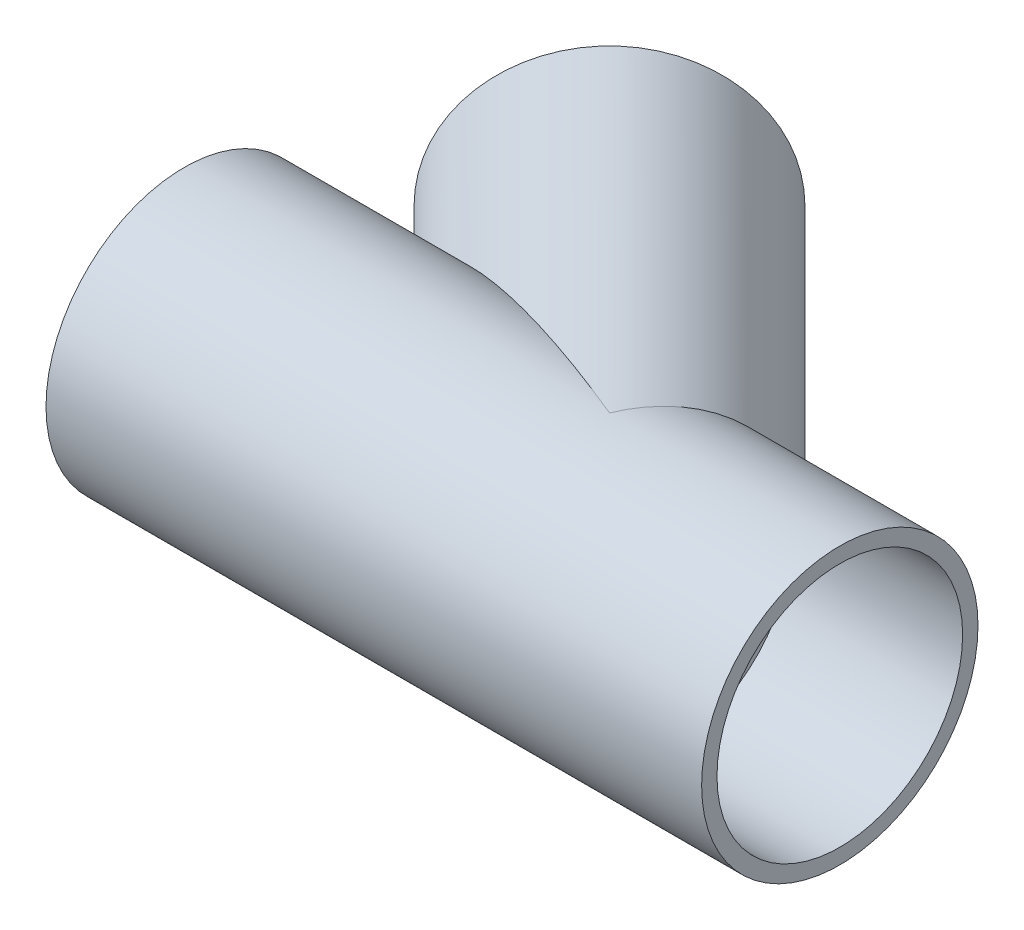
ISO-10303-21;
HEADER;
FILE_DESCRIPTION(('STEP AP214'),'2;1');
FILE_NAME('part.step','',(''),(''),'','','');
FILE_SCHEMA(('AUTOMOTIVE_DESIGN { 1 0 10303 214 1 1 1 1 }'));
ENDSEC;
DATA;
#1=APPLICATION_CONTEXT('core data for automotive mechanical design processes');
#2=APPLICATION_PROTOCOL_DEFINITION('international standard','automotive_design',2000,#1);
#3=PRODUCT_CONTEXT('',#1,'mechanical');
#4=PRODUCT('Part','Part','',(#3));
#5=PRODUCT_RELATED_PRODUCT_CATEGORY('part','',(#4));
#6=PRODUCT_DEFINITION_FORMATION('','',#4);
#7=PRODUCT_DEFINITION_CONTEXT('part definition',#1,'design');
#8=PRODUCT_DEFINITION('design','',#6,#7);
#9=PRODUCT_DEFINITION_SHAPE('','',#8);
#10=(LENGTH_UNIT() NAMED_UNIT(*) SI_UNIT(.MILLI.,.METRE.));
#11=(NAMED_UNIT(*) PLANE_ANGLE_UNIT() SI_UNIT($,.RADIAN.));
#12=(NAMED_UNIT(*) SI_UNIT($,.STERADIAN.) SOLID_ANGLE_UNIT());
#13=UNCERTAINTY_MEASURE_WITH_UNIT(LENGTH_MEASURE(1.E-05),#10,'distance_accuracy_value','');
#14=(GEOMETRIC_REPRESENTATION_CONTEXT(3) GLOBAL_UNCERTAINTY_ASSIGNED_CONTEXT((#13)) GLOBAL_UNIT_ASSIGNED_CONTEXT((#10,
#11,#12)) REPRESENTATION_CONTEXT('',''));
#15=CARTESIAN_POINT('',(0.,0.,0.));
#16=DIRECTION('',(0.,0.,1.));
#17=DIRECTION('',(1.,0.,0.));
#18=AXIS2_PLACEMENT_3D('',#15,#16,#17);
#19=CARTESIAN_POINT('',(-6.29663489310153,0.,0.));
#20=DIRECTION('',(1.,0.,0.));
#21=DIRECTION('',(0.,0.,-1.));
#22=AXIS2_PLACEMENT_3D('',#19,#20,#21);
#23=CYLINDRICAL_SURFACE('',#22,13.6);
#24=CARTESIAN_POINT('',(7.8,0.,0.));
#25=DIRECTION('',(1.,0.,0.));
#26=DIRECTION('',(0.,0.,-1.));
#27=AXIS2_PLACEMENT_3D('',#24,#25,#26);
#28=CIRCLE('',#27,13.6);
#29=CARTESIAN_POINT('',(7.8,0.,-13.6));
#30=VERTEX_POINT('',#29);
#31=EDGE_CURVE('E149',#30,#30,#28,.T.);
#32=ORIENTED_EDGE('',*,*,#31,.T.);
#33=EDGE_LOOP('',(#32));
#34=FACE_BOUND('',#33,.T.);
#35=CARTESIAN_POINT('',(0.,0.,0.));
#36=DIRECTION('',(0.923879532511286,0.,0.382683432365091));
#37=DIRECTION('',(-0.382683432365091,0.,0.923879532511287));
#38=AXIS2_PLACEMENT_3D('',#35,#36,#37);
#39=ELLIPSE('',#38,14.7205339239766,13.6);
#40=CARTESIAN_POINT('',(0.,-13.6,0.));
#41=VERTEX_POINT('',#40);
#42=CARTESIAN_POINT('',(0.,13.6,0.));
#43=VERTEX_POINT('',#42);
#44=EDGE_CURVE('E153',#41,#43,#39,.T.);
#45=ORIENTED_EDGE('',*,*,#44,.F.);
#46=CARTESIAN_POINT('',(0.,0.,0.));
#47=DIRECTION('',(-0.38268343236509,0.,0.923879532511286));
#48=DIRECTION('',(0.923879532511286,0.,0.382683432365091));
#49=AXIS2_PLACEMENT_3D('',#46,#47,#48);
#50=ELLIPSE('',#49,35.5385126446374,13.6);
#51=EDGE_CURVE('E62',#41,#43,#50,.F.);
#52=ORIENTED_EDGE('',*,*,#51,.T.);
#53=EDGE_LOOP('',(#45,#52));
#54=FACE_BOUND('',#53,.T.);
#55=CARTESIAN_POINT('',(-33.2,0.,0.));
#56=DIRECTION('',(-1.,0.,0.));
#57=DIRECTION('',(0.,0.,1.));
#58=AXIS2_PLACEMENT_3D('',#55,#56,#57);
#59=CIRCLE('',#58,13.6);
#60=CARTESIAN_POINT('',(-33.2,0.,13.6));
#61=VERTEX_POINT('',#60);
#62=EDGE_CURVE('E57',#61,#61,#59,.T.);
#63=ORIENTED_EDGE('',*,*,#62,.T.);
#64=EDGE_LOOP('',(#63));
#65=FACE_BOUND('',#64,.T.);
#66=ADVANCED_FACE('F53',(#34,#54,#65),#23,.F.);
#67=CARTESIAN_POINT('',(-44.9355339059326,0.,-44.9355339059327));
#68=DIRECTION('',(0.707106781186546,0.,0.707106781186549));
#69=DIRECTION('',(0.707106781186549,0.,-0.707106781186546));
#70=AXIS2_PLACEMENT_3D('',#67,#68,#69);
#71=CYLINDRICAL_SURFACE('',#70,13.6);
#72=CARTESIAN_POINT('',(-33.2,-4.86853482768928,-15.2413046892835));
#73=CARTESIAN_POINT('',(-33.3244681017264,-4.72405159532943,-15.2874486021489));
#74=CARTESIAN_POINT('',(-33.4455982056215,-4.57622184765021,-15.3324136773489));
#75=CARTESIAN_POINT('',(-33.6800760102499,-4.27344722811289,-15.4195514218226));
#76=CARTESIAN_POINT('',(-33.7934144125979,-4.11849421113384,-15.4617207526722));
#77=CARTESIAN_POINT('',(-34.0124551916055,-3.7991278618265,-15.5432992517087));
#78=CARTESIAN_POINT('',(-34.1180256285823,-3.63461113339689,-15.5826604838994));
#79=CARTESIAN_POINT('',(-34.3181189273945,-3.29813985669914,-15.6573293322666));
#80=CARTESIAN_POINT('',(-34.4126450147334,-3.12618750020844,-15.6926381319028));
#81=CARTESIAN_POINT('',(-34.5896291935247,-2.77357849560614,-15.7587968584561));
#82=CARTESIAN_POINT('',(-34.6719874888855,-2.59286445351396,-15.7896098895119));
#83=CARTESIAN_POINT('',(-34.8218064059133,-2.2245451063047,-15.8456957854302));
#84=CARTESIAN_POINT('',(-34.8892713407612,-2.03694181474915,-15.8709702542685));
#85=CARTESIAN_POINT('',(-35.0070871739665,-1.65683743685648,-15.9151272754877));
#86=CARTESIAN_POINT('',(-35.0575326254052,-1.4643700171583,-15.934045140012));
#87=CARTESIAN_POINT('',(-35.1401571365977,-1.07500273336272,-15.9650392676209));
#88=CARTESIAN_POINT('',(-35.1723393757944,-0.878103646983305,-15.9771167215519));
#89=CARTESIAN_POINT('',(-35.2153998054927,-0.498160700046245,-15.993278378903));
#90=CARTESIAN_POINT('',(-35.2278180495339,-0.315315688887114,-15.9979403897848));
#91=CARTESIAN_POINT('',(-35.2358783704707,0.0507902895660343,-16.0009662526997));
#92=CARTESIAN_POINT('',(-35.2315217087008,0.234051224550463,-15.9993305782666));
#93=CARTESIAN_POINT('',(-35.206164302814,0.599468591416893,-15.9898120311146));
#94=CARTESIAN_POINT('',(-35.1851432454321,0.781623401736292,-15.9819215340052));
#95=CARTESIAN_POINT('',(-35.1271185243967,1.14300160026838,-15.9601481955119));
#96=CARTESIAN_POINT('',(-35.0901129690087,1.32222463890511,-15.9462646448619));
#97=CARTESIAN_POINT('',(-34.9980354776251,1.68909129558625,-15.9117349686436));
#98=CARTESIAN_POINT('',(-34.9418584111708,1.87641728637466,-15.8906753356013));
#99=CARTESIAN_POINT('',(-34.8141119481743,2.24493420975253,-15.8428158345539));
#100=CARTESIAN_POINT('',(-34.7425426745378,2.42612519131629,-15.8160160123838));
#101=CARTESIAN_POINT('',(-34.5856500647023,2.78204568442004,-15.7573106471418));
#102=CARTESIAN_POINT('',(-34.5002962410491,2.95675979283973,-15.725393787823));
#103=CARTESIAN_POINT('',(-34.3176792081304,3.29902710740497,-15.6571671380452));
#104=CARTESIAN_POINT('',(-34.2204100034332,3.46657665090183,-15.6208551362042));
#105=CARTESIAN_POINT('',(-33.9810302650555,3.84977407005102,-15.5315810921899));
#106=CARTESIAN_POINT('',(-33.8348752648837,4.06253927334722,-15.4771395682447));
#107=CARTESIAN_POINT('',(-33.5277565233446,4.47507223991705,-15.3629186420274));
#108=CARTESIAN_POINT('',(-33.3668170767776,4.67486043708517,-15.3031480015146));
#109=CARTESIAN_POINT('',(-33.2,4.86853482768928,-15.2413046892835));
#110=B_SPLINE_CURVE_WITH_KNOTS('',3,(#72,#73,#74,#75,#76,#77,#78,#79,#80,#81,#82,#83,#84,#85,
#86,#87,#88,#89,#90,#91,#92,#93,#94,#95,#96,#97,#98,#99,#100,#101,#102,#103,#104,#105,#106,#107,
#108,#109),.UNSPECIFIED.,.F.,.F.,(4,2,2,2,2,2,2,2,2,2,2,2,2,2,2,2,2,2,4),(0.,0.588662312954064,
1.17801534280278,1.77577270218087,2.37335504776723,2.97559477402446,3.57765985961078,
4.17632281999822,4.77488152714232,5.32400262416036,5.8730824326083,6.42283257954953,
6.97264780619446,7.56188532143159,8.15111813181881,8.74167246684499,9.33252517962953,
10.1230714069509,10.9123410325832),.UNSPECIFIED.);
#111=CARTESIAN_POINT('',(-33.2,-4.86853482768928,-15.2413046892835));
#112=VERTEX_POINT('',#111);
#113=CARTESIAN_POINT('',(-33.2,4.86853482768928,-15.2413046892835));
#114=VERTEX_POINT('',#113);
#115=EDGE_CURVE('E101',#112,#114,#110,.T.);
#116=ORIENTED_EDGE('',*,*,#115,.F.);
#117=CARTESIAN_POINT('',(-33.2,0.,-33.2000000000001));
#118=DIRECTION('',(-1.,0.,0.));
#119=DIRECTION('',(0.,0.,1.));
#120=AXIS2_PLACEMENT_3D('',#117,#118,#119);
#121=ELLIPSE('',#120,19.2333044482741,13.6);
#122=EDGE_CURVE('E92',#112,#114,#121,.T.);
#123=ORIENTED_EDGE('',*,*,#122,.T.);
#124=EDGE_LOOP('',(#116,#123));
#125=FACE_BOUND('',#124,.T.);
#126=ORIENTED_EDGE('',*,*,#51,.F.);
#127=ORIENTED_EDGE('',*,*,#44,.T.);
#128=EDGE_LOOP('',(#126,#127));
#129=FACE_BOUND('',#128,.T.);
#130=CARTESIAN_POINT('',(-25.7022294576585,0.,-25.7022294576586));
#131=DIRECTION('',(-0.707106781186546,0.,-0.707106781186549));
#132=DIRECTION('',(-0.707106781186549,0.,0.707106781186546));
#133=AXIS2_PLACEMENT_3D('',#130,#131,#132);
#134=CIRCLE('',#133,13.6);
#135=CARTESIAN_POINT('',(-35.3188816817956,0.,-16.0855772335216));
#136=VERTEX_POINT('',#135);
#137=EDGE_CURVE('E302',#136,#136,#134,.T.);
#138=ORIENTED_EDGE('',*,*,#137,.T.);
#139=EDGE_LOOP('',(#138));
#140=FACE_BOUND('',#139,.T.);
#141=ADVANCED_FACE('F104',(#125,#129,#140),#71,.F.);
#142=CARTESIAN_POINT('',(30.,0.,0.));
#143=DIRECTION('',(-1.,0.,0.));
#144=DIRECTION('',(0.,0.,1.));
#145=AXIS2_PLACEMENT_3D('',#142,#143,#144);
#146=PLANE('',#145);
#147=CARTESIAN_POINT('',(30.,0.,0.));
#148=DIRECTION('',(1.,0.,0.));
#149=DIRECTION('',(0.,0.,-1.));
#150=AXIS2_PLACEMENT_3D('',#147,#148,#149);
#151=CIRCLE('',#150,16.);
#152=CARTESIAN_POINT('',(30.,0.,-16.));
#153=VERTEX_POINT('',#152);
#154=EDGE_CURVE('E282',#153,#153,#151,.T.);
#155=ORIENTED_EDGE('',*,*,#154,.F.);
#156=EDGE_LOOP('',(#155));
#157=FACE_BOUND('',#156,.T.);
#158=CARTESIAN_POINT('',(30.,0.,0.));
#159=DIRECTION('',(-1.,0.,0.));
#160=DIRECTION('',(0.,0.,1.));
#161=AXIS2_PLACEMENT_3D('',#158,#159,#160);
#162=CIRCLE('',#161,18.);
#163=CARTESIAN_POINT('',(30.,0.,18.));
#164=VERTEX_POINT('',#163);
#165=EDGE_CURVE('E285',#164,#164,#162,.T.);
#166=ORIENTED_EDGE('',*,*,#165,.F.);
#167=EDGE_LOOP('',(#166));
#168=FACE_BOUND('',#167,.T.);
#169=ADVANCED_FACE('F55',(#157,#168),#146,.F.);
#170=CARTESIAN_POINT('',(-41.3999999999998,0.,-41.4));
#171=DIRECTION('',(-0.707106781186546,0.,-0.707106781186549));
#172=DIRECTION('',(-0.707106781186549,0.,0.707106781186546));
#173=AXIS2_PLACEMENT_3D('',#170,#171,#172);
#174=PLANE('',#173);
#175=CARTESIAN_POINT('',(-41.3999999999998,0.,-41.4));
#176=DIRECTION('',(-0.707106781186546,0.,-0.707106781186549));
#177=DIRECTION('',(-0.707106781186549,0.,0.707106781186546));
#178=AXIS2_PLACEMENT_3D('',#175,#176,#177);
#179=CIRCLE('',#178,16.);
#180=CARTESIAN_POINT('',(-52.7137084989846,0.,-30.0862915010152));
#181=VERTEX_POINT('',#180);
#182=EDGE_CURVE('E96',#181,#181,#179,.T.);
#183=ORIENTED_EDGE('',*,*,#182,.F.);
#184=EDGE_LOOP('',(#183));
#185=FACE_BOUND('',#184,.T.);
#186=CARTESIAN_POINT('',(-41.3999999999998,0.,-41.4));
#187=DIRECTION('',(-0.707106781186546,0.,-0.707106781186549));
#188=DIRECTION('',(-0.707106781186549,0.,0.707106781186546));
#189=AXIS2_PLACEMENT_3D('',#186,#187,#188);
#190=CIRCLE('',#189,18.);
#191=CARTESIAN_POINT('',(-54.1279220613577,0.,-28.6720779386422));
#192=VERTEX_POINT('',#191);
#193=EDGE_CURVE('E287',#192,#192,#190,.T.);
#194=ORIENTED_EDGE('',*,*,#193,.T.);
#195=EDGE_LOOP('',(#194));
#196=FACE_BOUND('',#195,.T.);
#197=ADVANCED_FACE('F202',(#185,#196),#174,.T.);
#198=CARTESIAN_POINT('',(-8.30142853498731,0.,0.));
#199=DIRECTION('',(1.,0.,0.));
#200=DIRECTION('',(0.,0.,-1.));
#201=AXIS2_PLACEMENT_3D('',#198,#199,#200);
#202=CYLINDRICAL_SURFACE('',#201,18.);
#203=CARTESIAN_POINT('',(0.,0.,0.));
#204=DIRECTION('',(0.923879532511287,0.,0.382683432365091));
#205=DIRECTION('',(-0.382683432365091,0.,0.923879532511287));
#206=AXIS2_PLACEMENT_3D('',#203,#204,#205);
#207=ELLIPSE('',#206,19.4830596052631,18.);
#208=CARTESIAN_POINT('',(0.,-18.,0.));
#209=VERTEX_POINT('',#208);
#210=CARTESIAN_POINT('',(0.,18.,0.));
#211=VERTEX_POINT('',#210);
#212=EDGE_CURVE('E291',#209,#211,#207,.T.);
#213=ORIENTED_EDGE('',*,*,#212,.T.);
#214=CARTESIAN_POINT('',(0.,0.,0.));
#215=DIRECTION('',(-0.382683432365091,0.,0.923879532511286));
#216=DIRECTION('',(0.923879532511286,0.,0.382683432365091));
#217=AXIS2_PLACEMENT_3D('',#214,#215,#216);
#218=ELLIPSE('',#217,47.0362667355494,18.);
#219=EDGE_CURVE('E297',#209,#211,#218,.F.);
#220=ORIENTED_EDGE('',*,*,#219,.F.);
#221=EDGE_LOOP('',(#213,#220));
#222=FACE_BOUND('',#221,.T.);
#223=ORIENTED_EDGE('',*,*,#165,.T.);
#224=EDGE_LOOP('',(#223));
#225=FACE_BOUND('',#224,.T.);
#226=CARTESIAN_POINT('',(-55.4,0.,0.));
#227=DIRECTION('',(1.,0.,0.));
#228=DIRECTION('',(0.,0.,-1.));
#229=AXIS2_PLACEMENT_3D('',#226,#227,#228);
#230=CIRCLE('',#229,18.);
#231=CARTESIAN_POINT('',(-55.4,0.,-18.));
#232=VERTEX_POINT('',#231);
#233=EDGE_CURVE('E288',#232,#232,#230,.T.);
#234=ORIENTED_EDGE('',*,*,#233,.T.);
#235=EDGE_LOOP('',(#234));
#236=FACE_BOUND('',#235,.T.);
#237=ADVANCED_FACE('F194',(#222,#225,#236),#202,.T.);
#238=CARTESIAN_POINT('',(-41.3999999999998,0.,-41.4));
#239=DIRECTION('',(0.707106781186546,0.,0.707106781186549));
#240=DIRECTION('',(0.707106781186549,0.,-0.707106781186546));
#241=AXIS2_PLACEMENT_3D('',#238,#239,#240);
#242=CYLINDRICAL_SURFACE('',#241,18.);
#243=ORIENTED_EDGE('',*,*,#193,.F.);
#244=EDGE_LOOP('',(#243));
#245=FACE_BOUND('',#244,.T.);
#246=ORIENTED_EDGE('',*,*,#212,.F.);
#247=ORIENTED_EDGE('',*,*,#219,.T.);
#248=EDGE_LOOP('',(#246,#247));
#249=FACE_BOUND('',#248,.T.);
#250=ADVANCED_FACE('F145',(#245,#249),#242,.T.);
#251=CARTESIAN_POINT('',(-55.4,0.,0.));
#252=DIRECTION('',(1.,0.,0.));
#253=DIRECTION('',(0.,0.,-1.));
#254=AXIS2_PLACEMENT_3D('',#251,#252,#253);
#255=PLANE('',#254);
#256=CARTESIAN_POINT('',(-55.4,0.,0.));
#257=DIRECTION('',(-1.,0.,0.));
#258=DIRECTION('',(0.,0.,1.));
#259=AXIS2_PLACEMENT_3D('',#256,#257,#258);
#260=CIRCLE('',#259,16.);
#261=CARTESIAN_POINT('',(-55.4,0.,16.));
#262=VERTEX_POINT('',#261);
#263=EDGE_CURVE('E102',#262,#262,#260,.T.);
#264=ORIENTED_EDGE('',*,*,#263,.F.);
#265=EDGE_LOOP('',(#264));
#266=FACE_BOUND('',#265,.T.);
#267=ORIENTED_EDGE('',*,*,#233,.F.);
#268=EDGE_LOOP('',(#267));
#269=FACE_BOUND('',#268,.T.);
#270=ADVANCED_FACE('F138',(#266,#269),#255,.F.);
#271=CARTESIAN_POINT('',(7.8,0.,0.));
#272=DIRECTION('',(1.,0.,0.));
#273=DIRECTION('',(0.,0.,-1.));
#274=AXIS2_PLACEMENT_3D('',#271,#272,#273);
#275=CYLINDRICAL_SURFACE('',#274,16.);
#276=CARTESIAN_POINT('',(7.8,0.,0.));
#277=DIRECTION('',(1.,0.,0.));
#278=DIRECTION('',(0.,0.,-1.));
#279=AXIS2_PLACEMENT_3D('',#276,#277,#278);
#280=CIRCLE('',#279,16.);
#281=CARTESIAN_POINT('',(7.8,0.,-16.));
#282=VERTEX_POINT('',#281);
#283=EDGE_CURVE('E301',#282,#282,#280,.T.);
#284=ORIENTED_EDGE('',*,*,#283,.F.);
#285=EDGE_LOOP('',(#284));
#286=FACE_BOUND('',#285,.T.);
#287=ORIENTED_EDGE('',*,*,#154,.T.);
#288=EDGE_LOOP('',(#287));
#289=FACE_BOUND('',#288,.T.);
#290=ADVANCED_FACE('F135',(#286,#289),#275,.F.);
#291=CARTESIAN_POINT('',(7.8,0.,0.));
#292=DIRECTION('',(1.,0.,0.));
#293=DIRECTION('',(0.,0.,-1.));
#294=AXIS2_PLACEMENT_3D('',#291,#292,#293);
#295=PLANE('',#294);
#296=ORIENTED_EDGE('',*,*,#31,.F.);
#297=EDGE_LOOP('',(#296));
#298=FACE_BOUND('',#297,.T.);
#299=ORIENTED_EDGE('',*,*,#283,.T.);
#300=EDGE_LOOP('',(#299));
#301=FACE_BOUND('',#300,.T.);
#302=ADVANCED_FACE('F131',(#298,#301),#295,.T.);
#303=CARTESIAN_POINT('',(-25.7022294576585,0.,-25.7022294576586));
#304=DIRECTION('',(-0.707106781186546,0.,-0.707106781186549));
#305=DIRECTION('',(-0.707106781186549,0.,0.707106781186546));
#306=AXIS2_PLACEMENT_3D('',#303,#304,#305);
#307=CYLINDRICAL_SURFACE('',#306,16.);
#308=CARTESIAN_POINT('',(-25.7022294576585,0.,-25.7022294576586));
#309=DIRECTION('',(-0.707106781186546,0.,-0.707106781186549));
#310=DIRECTION('',(-0.707106781186549,0.,0.707106781186546));
#311=AXIS2_PLACEMENT_3D('',#308,#309,#310);
#312=CIRCLE('',#311,16.);
#313=CARTESIAN_POINT('',(-36.348441482246,5.41445648750248,-15.0560174330711));
#314=VERTEX_POINT('',#313);
#315=CARTESIAN_POINT('',(-36.348441482246,-5.41445648750248,-15.0560174330711));
#316=VERTEX_POINT('',#315);
#317=EDGE_CURVE('E304',#314,#316,#312,.T.);
#318=ORIENTED_EDGE('',*,*,#317,.F.);
#319=CARTESIAN_POINT('',(0.,0.,0.));
#320=DIRECTION('',(0.38268343236509,0.,-0.923879532511286));
#321=DIRECTION('',(-0.923879532511287,0.,-0.38268343236509));
#322=AXIS2_PLACEMENT_3D('',#319,#320,#321);
#323=ELLIPSE('',#322,41.810014876044,16.);
#324=EDGE_CURVE('E74',#314,#316,#323,.F.);
#325=ORIENTED_EDGE('',*,*,#324,.T.);
#326=EDGE_LOOP('',(#318,#325));
#327=FACE_BOUND('',#326,.T.);
#328=ORIENTED_EDGE('',*,*,#182,.T.);
#329=EDGE_LOOP('',(#328));
#330=FACE_BOUND('',#329,.T.);
#331=ADVANCED_FACE('F127',(#327,#330),#307,.F.);
#332=CARTESIAN_POINT('',(-25.7022294576585,0.,-25.7022294576586));
#333=DIRECTION('',(-0.707106781186546,0.,-0.707106781186549));
#334=DIRECTION('',(-0.707106781186549,0.,0.707106781186546));
#335=AXIS2_PLACEMENT_3D('',#332,#333,#334);
#336=PLANE('',#335);
#337=CARTESIAN_POINT('',(-51.4044589153172,0.,0.));
#338=DIRECTION('',(-0.707106781186546,0.,-0.707106781186549));
#339=DIRECTION('',(-0.707106781186549,0.,0.707106781186546));
#340=AXIS2_PLACEMENT_3D('',#337,#338,#339);
#341=ELLIPSE('',#340,22.6274169979696,16.);
#342=EDGE_CURVE('E12',#314,#316,#341,.T.);
#343=ORIENTED_EDGE('',*,*,#342,.F.);
#344=ORIENTED_EDGE('',*,*,#317,.T.);
#345=EDGE_LOOP('',(#343,#344));
#346=FACE_BOUND('',#345,.T.);
#347=ORIENTED_EDGE('',*,*,#137,.F.);
#348=EDGE_LOOP('',(#347));
#349=FACE_BOUND('',#348,.T.);
#350=ADVANCED_FACE('F124',(#346,#349),#336,.T.);
#351=CARTESIAN_POINT('',(-33.2,0.,0.));
#352=DIRECTION('',(-1.,0.,0.));
#353=DIRECTION('',(0.,0.,1.));
#354=AXIS2_PLACEMENT_3D('',#351,#352,#353);
#355=CYLINDRICAL_SURFACE('',#354,16.);
#356=ORIENTED_EDGE('',*,*,#115,.T.);
#357=CARTESIAN_POINT('',(-33.2,0.,0.));
#358=DIRECTION('',(-1.,0.,0.));
#359=DIRECTION('',(0.,0.,1.));
#360=AXIS2_PLACEMENT_3D('',#357,#358,#359);
#361=CIRCLE('',#360,16.);
#362=EDGE_CURVE('E68',#112,#114,#361,.T.);
#363=ORIENTED_EDGE('',*,*,#362,.F.);
#364=EDGE_LOOP('',(#356,#363));
#365=FACE_BOUND('',#364,.T.);
#366=ORIENTED_EDGE('',*,*,#263,.T.);
#367=EDGE_LOOP('',(#366));
#368=FACE_BOUND('',#367,.T.);
#369=ORIENTED_EDGE('',*,*,#342,.T.);
#370=ORIENTED_EDGE('',*,*,#324,.F.);
#371=EDGE_LOOP('',(#369,#370));
#372=FACE_BOUND('',#371,.T.);
#373=ADVANCED_FACE('F99',(#365,#368,#372),#355,.F.);
#374=CARTESIAN_POINT('',(-33.2,0.,0.));
#375=DIRECTION('',(-1.,0.,0.));
#376=DIRECTION('',(0.,0.,1.));
#377=AXIS2_PLACEMENT_3D('',#374,#375,#376);
#378=PLANE('',#377);
#379=ORIENTED_EDGE('',*,*,#62,.F.);
#380=EDGE_LOOP('',(#379));
#381=FACE_BOUND('',#380,.T.);
#382=ORIENTED_EDGE('',*,*,#362,.T.);
#383=ORIENTED_EDGE('',*,*,#122,.F.);
#384=EDGE_LOOP('',(#382,#383));
#385=FACE_BOUND('',#384,.T.);
#386=ADVANCED_FACE('F93',(#381,#385),#378,.T.);
#387=CLOSED_SHELL('',(#66,#141,#169,#197,#237,#250,#270,#290,#302,#331,#350,#373,#386));
#388=MANIFOLD_SOLID_BREP('B2',#387);
#389=ADVANCED_BREP_SHAPE_REPRESENTATION('',(#18,#388),#14);
#390=SHAPE_DEFINITION_REPRESENTATION(#9,#389);
ENDSEC;
END-ISO-10303-21;
